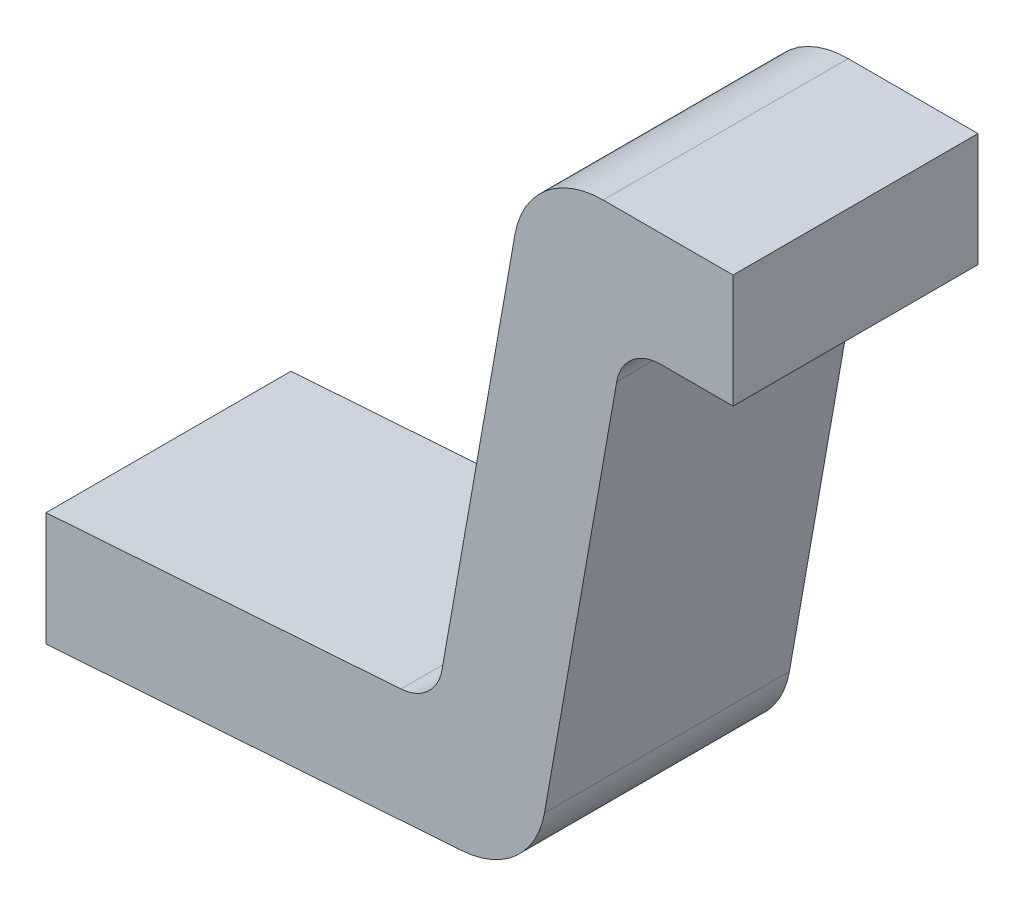
ISO-10303-21;
HEADER;
FILE_DESCRIPTION(('STEP AP214'),'2;1');
FILE_NAME('part.step','',(''),(''),'','','');
FILE_SCHEMA(('AUTOMOTIVE_DESIGN { 1 0 10303 214 1 1 1 1 }'));
ENDSEC;
DATA;
#1=APPLICATION_CONTEXT('core data for automotive mechanical design processes');
#2=APPLICATION_PROTOCOL_DEFINITION('international standard','automotive_design',2000,#1);
#3=PRODUCT_CONTEXT('',#1,'mechanical');
#4=PRODUCT('Part','Part','',(#3));
#5=PRODUCT_RELATED_PRODUCT_CATEGORY('part','',(#4));
#6=PRODUCT_DEFINITION_FORMATION('','',#4);
#7=PRODUCT_DEFINITION_CONTEXT('part definition',#1,'design');
#8=PRODUCT_DEFINITION('design','',#6,#7);
#9=PRODUCT_DEFINITION_SHAPE('','',#8);
#10=(LENGTH_UNIT() NAMED_UNIT(*) SI_UNIT(.MILLI.,.METRE.));
#11=(NAMED_UNIT(*) PLANE_ANGLE_UNIT() SI_UNIT($,.RADIAN.));
#12=(NAMED_UNIT(*) SI_UNIT($,.STERADIAN.) SOLID_ANGLE_UNIT());
#13=UNCERTAINTY_MEASURE_WITH_UNIT(LENGTH_MEASURE(1.E-05),#10,'distance_accuracy_value','');
#14=(GEOMETRIC_REPRESENTATION_CONTEXT(3) GLOBAL_UNCERTAINTY_ASSIGNED_CONTEXT((#13)) GLOBAL_UNIT_ASSIGNED_CONTEXT((#10,
#11,#12)) REPRESENTATION_CONTEXT('',''));
#15=CARTESIAN_POINT('',(0.,0.,0.));
#16=DIRECTION('',(0.,0.,1.));
#17=DIRECTION('',(1.,0.,0.));
#18=AXIS2_PLACEMENT_3D('',#15,#16,#17);
#19=CARTESIAN_POINT('',(1.029116687923,0.845,0.));
#20=DIRECTION('',(0.,0.,1.));
#21=DIRECTION('',(-0.642787609686799,0.76604444311876,0.));
#22=AXIS2_PLACEMENT_3D('',#19,#20,#21);
#23=CYLINDRICAL_SURFACE('',#22,0.075);
#24=DIRECTION('',(0.,0.,1.));
#25=VECTOR('',#24,1.);
#26=CARTESIAN_POINT('',(0.98090761719649,0.902453333233907,0.));
#27=LINE('',#26,#25);
#28=CARTESIAN_POINT('',(0.98090761719649,0.902453333233907,0.));
#29=VERTEX_POINT('',#28);
#30=CARTESIAN_POINT('',(0.98090761719649,0.902453333233907,0.41));
#31=VERTEX_POINT('',#30);
#32=EDGE_CURVE('E232',#29,#31,#27,.T.);
#33=ORIENTED_EDGE('',*,*,#32,.F.);
#34=CARTESIAN_POINT('',(1.029116687923,0.845,0.));
#35=DIRECTION('',(0.,0.,-1.));
#36=DIRECTION('',(-0.642787609686799,0.76604444311876,0.));
#37=AXIS2_PLACEMENT_3D('',#34,#35,#36);
#38=CIRCLE('',#37,0.075);
#39=CARTESIAN_POINT('',(1.029116687923,0.92,0.));
#40=VERTEX_POINT('',#39);
#41=EDGE_CURVE('E297',#29,#40,#38,.T.);
#42=ORIENTED_EDGE('',*,*,#41,.T.);
#43=DIRECTION('',(0.,0.,1.));
#44=VECTOR('',#43,1.);
#45=CARTESIAN_POINT('',(1.029116687923,0.92,0.));
#46=LINE('',#45,#44);
#47=CARTESIAN_POINT('',(1.029116687923,0.92,0.41));
#48=VERTEX_POINT('',#47);
#49=EDGE_CURVE('E11',#40,#48,#46,.T.);
#50=ORIENTED_EDGE('',*,*,#49,.T.);
#51=CARTESIAN_POINT('',(1.029116687923,0.845,0.41));
#52=DIRECTION('',(0.,0.,1.));
#53=DIRECTION('',(-0.642787609686799,0.76604444311876,0.));
#54=AXIS2_PLACEMENT_3D('',#51,#52,#53);
#55=CIRCLE('',#54,0.075);
#56=EDGE_CURVE('E249',#48,#31,#55,.T.);
#57=ORIENTED_EDGE('',*,*,#56,.T.);
#58=EDGE_LOOP('',(#33,#42,#50,#57));
#59=FACE_BOUND('',#58,.T.);
#60=ADVANCED_FACE('F16',(#59),#23,.F.);
#61=CARTESIAN_POINT('',(0.966184215585,0.92,0.));
#62=DIRECTION('',(0.,-1.,0.));
#63=DIRECTION('',(0.,0.,-1.));
#64=AXIS2_PLACEMENT_3D('',#61,#62,#63);
#65=PLANE('',#64);
#66=ORIENTED_EDGE('',*,*,#49,.F.);
#67=DIRECTION('',(1.,0.,0.));
#68=VECTOR('',#67,1.);
#69=CARTESIAN_POINT('',(0.966184215585,0.92,0.));
#70=LINE('',#69,#68);
#71=CARTESIAN_POINT('',(1.15,0.92,0.));
#72=VERTEX_POINT('',#71);
#73=EDGE_CURVE('E197',#40,#72,#70,.T.);
#74=ORIENTED_EDGE('',*,*,#73,.T.);
#75=DIRECTION('',(0.,0.,1.));
#76=VECTOR('',#75,1.);
#77=CARTESIAN_POINT('',(1.15,0.92,0.));
#78=LINE('',#77,#76);
#79=CARTESIAN_POINT('',(1.15,0.92,0.41));
#80=VERTEX_POINT('',#79);
#81=EDGE_CURVE('E340',#72,#80,#78,.T.);
#82=ORIENTED_EDGE('',*,*,#81,.T.);
#83=DIRECTION('',(1.,0.,0.));
#84=VECTOR('',#83,1.);
#85=CARTESIAN_POINT('',(0.966184215585,0.92,0.41));
#86=LINE('',#85,#84);
#87=EDGE_CURVE('E244',#48,#80,#86,.T.);
#88=ORIENTED_EDGE('',*,*,#87,.F.);
#89=EDGE_LOOP('',(#66,#74,#82,#88));
#90=FACE_BOUND('',#89,.T.);
#91=ADVANCED_FACE('F375',(#90),#65,.T.);
#92=CARTESIAN_POINT('',(0.588978184151,0.306832469713,0.));
#93=DIRECTION('',(0.,0.,1.));
#94=DIRECTION('',(0.669130606359133,-0.743144825477147,0.));
#95=AXIS2_PLACEMENT_3D('',#92,#93,#94);
#96=CYLINDRICAL_SURFACE('',#95,0.075);
#97=DIRECTION('',(0.,0.,1.));
#98=VECTOR('',#97,1.);
#99=CARTESIAN_POINT('',(0.639162979627935,0.251096607802214,0.));
#100=LINE('',#99,#98);
#101=CARTESIAN_POINT('',(0.639162979627935,0.251096607802214,0.));
#102=VERTEX_POINT('',#101);
#103=CARTESIAN_POINT('',(0.639162979627935,0.251096607802214,0.41));
#104=VERTEX_POINT('',#103);
#105=EDGE_CURVE('E192',#102,#104,#100,.T.);
#106=ORIENTED_EDGE('',*,*,#105,.F.);
#107=CARTESIAN_POINT('',(0.588978184151,0.306832469713,0.));
#108=DIRECTION('',(0.,0.,-1.));
#109=DIRECTION('',(0.669130606359133,-0.743144825477147,0.));
#110=AXIS2_PLACEMENT_3D('',#107,#108,#109);
#111=CIRCLE('',#110,0.075);
#112=CARTESIAN_POINT('',(0.594209919682,0.232015165944,0.));
#113=VERTEX_POINT('',#112);
#114=EDGE_CURVE('E189',#102,#113,#111,.T.);
#115=ORIENTED_EDGE('',*,*,#114,.T.);
#116=DIRECTION('',(0.,0.,1.));
#117=VECTOR('',#116,1.);
#118=CARTESIAN_POINT('',(0.594209919682,0.232015165944,0.));
#119=LINE('',#118,#117);
#120=CARTESIAN_POINT('',(0.594209919682,0.232015165944,0.41));
#121=VERTEX_POINT('',#120);
#122=EDGE_CURVE('E27',#113,#121,#119,.T.);
#123=ORIENTED_EDGE('',*,*,#122,.T.);
#124=CARTESIAN_POINT('',(0.588978184151,0.306832469713,0.41));
#125=DIRECTION('',(0.,0.,1.));
#126=DIRECTION('',(0.669130606359133,-0.743144825477147,0.));
#127=AXIS2_PLACEMENT_3D('',#124,#125,#126);
#128=CIRCLE('',#127,0.075);
#129=EDGE_CURVE('E241',#121,#104,#128,.T.);
#130=ORIENTED_EDGE('',*,*,#129,.T.);
#131=EDGE_LOOP('',(#106,#115,#123,#130));
#132=FACE_BOUND('',#131,.T.);
#133=ADVANCED_FACE('F190',(#132),#96,.F.);
#134=CARTESIAN_POINT('',(0.652663603731,0.236102645716,0.));
#135=DIRECTION('',(-0.0697564737441177,0.997564050259825,0.));
#136=DIRECTION('',(0.,0.,1.));
#137=AXIS2_PLACEMENT_3D('',#134,#135,#136);
#138=PLANE('',#137);
#139=ORIENTED_EDGE('',*,*,#122,.F.);
#140=DIRECTION('',(-0.997564050259825,-0.0697564737441177,0.));
#141=VECTOR('',#140,1.);
#142=CARTESIAN_POINT('',(0.652663603731,0.236102645716,0.));
#143=LINE('',#142,#141);
#144=CARTESIAN_POINT('',(0.,0.190463960635,0.));
#145=VERTEX_POINT('',#144);
#146=EDGE_CURVE('E180',#113,#145,#143,.T.);
#147=ORIENTED_EDGE('',*,*,#146,.T.);
#148=DIRECTION('',(0.,0.,1.));
#149=VECTOR('',#148,1.);
#150=CARTESIAN_POINT('',(0.,0.190463960635,0.));
#151=LINE('',#150,#149);
#152=CARTESIAN_POINT('',(0.,0.190463960635,0.41));
#153=VERTEX_POINT('',#152);
#154=EDGE_CURVE('E240',#145,#153,#151,.T.);
#155=ORIENTED_EDGE('',*,*,#154,.T.);
#156=DIRECTION('',(-0.997564050259825,-0.0697564737441177,0.));
#157=VECTOR('',#156,1.);
#158=CARTESIAN_POINT('',(0.652663603731,0.236102645716,0.41));
#159=LINE('',#158,#157);
#160=EDGE_CURVE('E183',#121,#153,#159,.T.);
#161=ORIENTED_EDGE('',*,*,#160,.F.);
#162=EDGE_LOOP('',(#139,#147,#155,#161));
#163=FACE_BOUND('',#162,.T.);
#164=ADVANCED_FACE('F178',(#163),#138,.T.);
#165=CARTESIAN_POINT('',(0.68662916084,0.198380072917,0.));
#166=DIRECTION('',(0.,0.,1.));
#167=DIRECTION('',(0.669130606359133,-0.743144825477147,0.));
#168=AXIS2_PLACEMENT_3D('',#165,#166,#167);
#169=CYLINDRICAL_SURFACE('',#168,0.15);
#170=DIRECTION('',(0.,0.,1.));
#171=VECTOR('',#170,1.);
#172=CARTESIAN_POINT('',(0.78699875179387,0.086908349095428,0.));
#173=LINE('',#172,#171);
#174=CARTESIAN_POINT('',(0.78699875179387,0.086908349095428,0.));
#175=VERTEX_POINT('',#174);
#176=CARTESIAN_POINT('',(0.78699875179387,0.086908349095428,0.41));
#177=VERTEX_POINT('',#176);
#178=EDGE_CURVE('E217',#175,#177,#173,.T.);
#179=ORIENTED_EDGE('',*,*,#178,.F.);
#180=CARTESIAN_POINT('',(0.68662916084,0.198380072917,0.));
#181=DIRECTION('',(0.,0.,1.));
#182=DIRECTION('',(0.669130606359133,-0.743144825477147,0.));
#183=AXIS2_PLACEMENT_3D('',#180,#181,#182);
#184=CIRCLE('',#183,0.15);
#185=CARTESIAN_POINT('',(0.834350323792,0.172332846267,0.));
#186=VERTEX_POINT('',#185);
#187=EDGE_CURVE('E329',#175,#186,#184,.T.);
#188=ORIENTED_EDGE('',*,*,#187,.T.);
#189=DIRECTION('',(0.,0.,1.));
#190=VECTOR('',#189,1.);
#191=CARTESIAN_POINT('',(0.834350323792,0.172332846267,0.));
#192=LINE('',#191,#190);
#193=CARTESIAN_POINT('',(0.834350323792,0.172332846267,0.41));
#194=VERTEX_POINT('',#193);
#195=EDGE_CURVE('E42',#186,#194,#192,.T.);
#196=ORIENTED_EDGE('',*,*,#195,.T.);
#197=CARTESIAN_POINT('',(0.68662916084,0.198380072917,0.41));
#198=DIRECTION('',(0.,0.,-1.));
#199=DIRECTION('',(0.669130606359133,-0.743144825477147,0.));
#200=AXIS2_PLACEMENT_3D('',#197,#198,#199);
#201=CIRCLE('',#200,0.15);
#202=EDGE_CURVE('E278',#194,#177,#201,.T.);
#203=ORIENTED_EDGE('',*,*,#202,.T.);
#204=EDGE_LOOP('',(#179,#188,#196,#203));
#205=FACE_BOUND('',#204,.T.);
#206=ADVANCED_FACE('F390',(#205),#169,.T.);
#207=CARTESIAN_POINT('',(0.814,0.05692042492202,0.));
#208=DIRECTION('',(0.98480775301219,-0.173648177667033,0.));
#209=DIRECTION('',(0.,0.,-1.));
#210=AXIS2_PLACEMENT_3D('',#207,#208,#209);
#211=PLANE('',#210);
#212=DIRECTION('',(0.,0.,-1.));
#213=VECTOR('',#212,1.);
#214=CARTESIAN_POINT('',(0.955256106447,0.858023613325,0.));
#215=LINE('',#214,#213);
#216=CARTESIAN_POINT('',(0.955256106447,0.858023613325,0.41));
#217=VERTEX_POINT('',#216);
#218=CARTESIAN_POINT('',(0.955256106447,0.858023613325,0.));
#219=VERTEX_POINT('',#218);
#220=EDGE_CURVE('E280',#217,#219,#215,.T.);
#221=ORIENTED_EDGE('',*,*,#220,.F.);
#222=DIRECTION('',(0.173648177667033,0.98480775301219,0.));
#223=VECTOR('',#222,1.);
#224=CARTESIAN_POINT('',(0.814,0.05692042492202,0.41));
#225=LINE('',#224,#223);
#226=EDGE_CURVE('E314',#194,#217,#225,.T.);
#227=ORIENTED_EDGE('',*,*,#226,.F.);
#228=ORIENTED_EDGE('',*,*,#195,.F.);
#229=DIRECTION('',(0.173648177667033,0.98480775301219,0.));
#230=VECTOR('',#229,1.);
#231=CARTESIAN_POINT('',(0.814,0.05692042492202,0.));
#232=LINE('',#231,#230);
#233=EDGE_CURVE('E301',#186,#219,#232,.T.);
#234=ORIENTED_EDGE('',*,*,#233,.T.);
#235=EDGE_LOOP('',(#221,#227,#228,#234));
#236=FACE_BOUND('',#235,.T.);
#237=ADVANCED_FACE('F385',(#236),#211,.T.);
#238=CARTESIAN_POINT('',(0.657250080214,0.470646116994,0.));
#239=DIRECTION('',(0.,0.,1.));
#240=DIRECTION('',(1.,0.,0.));
#241=AXIS2_PLACEMENT_3D('',#238,#239,#240);
#242=PLANE('',#241);
#243=CARTESIAN_POINT('',(0.68662916084,0.198380072917,0.));
#244=DIRECTION('',(0.,0.,1.));
#245=DIRECTION('',(0.669130606359133,-0.743144825477147,0.));
#246=AXIS2_PLACEMENT_3D('',#243,#244,#245);
#247=CIRCLE('',#246,0.15);
#248=CARTESIAN_POINT('',(0.697092631902,0.04874546537821,0.));
#249=VERTEX_POINT('',#248);
#250=EDGE_CURVE('E215',#249,#175,#247,.T.);
#251=ORIENTED_EDGE('',*,*,#250,.F.);
#252=DIRECTION('',(0.997564050259825,0.0697564737441177,0.));
#253=VECTOR('',#252,1.);
#254=CARTESIAN_POINT('',(0.,0.,0.));
#255=LINE('',#254,#253);
#256=CARTESIAN_POINT('',(0.,0.,0.));
#257=VERTEX_POINT('',#256);
#258=EDGE_CURVE('E130',#257,#249,#255,.T.);
#259=ORIENTED_EDGE('',*,*,#258,.F.);
#260=DIRECTION('',(0.,-1.,0.));
#261=VECTOR('',#260,1.);
#262=CARTESIAN_POINT('',(0.,0.190463960635,0.));
#263=LINE('',#262,#261);
#264=EDGE_CURVE('E203',#145,#257,#263,.T.);
#265=ORIENTED_EDGE('',*,*,#264,.F.);
#266=ORIENTED_EDGE('',*,*,#146,.F.);
#267=ORIENTED_EDGE('',*,*,#114,.F.);
#268=CARTESIAN_POINT('',(0.588978184151,0.306832469713,0.));
#269=DIRECTION('',(0.,0.,-1.));
#270=DIRECTION('',(0.669130606359133,-0.743144825477147,0.));
#271=AXIS2_PLACEMENT_3D('',#268,#269,#270);
#272=CIRCLE('',#271,0.075);
#273=CARTESIAN_POINT('',(0.662838765627,0.293808856388,0.));
#274=VERTEX_POINT('',#273);
#275=EDGE_CURVE('E253',#274,#102,#272,.T.);
#276=ORIENTED_EDGE('',*,*,#275,.F.);
#277=DIRECTION('',(-0.173648177667033,-0.98480775301219,0.));
#278=VECTOR('',#277,1.);
#279=CARTESIAN_POINT('',(0.806755285661,1.11,0.));
#280=LINE('',#279,#278);
#281=CARTESIAN_POINT('',(0.784899067386,0.98604722665,0.));
#282=VERTEX_POINT('',#281);
#283=EDGE_CURVE('E233',#282,#274,#280,.T.);
#284=ORIENTED_EDGE('',*,*,#283,.F.);
#285=CARTESIAN_POINT('',(0.932620230338,0.96,0.));
#286=DIRECTION('',(0.,0.,1.));
#287=DIRECTION('',(-0.642787609686799,0.76604444311876,0.));
#288=AXIS2_PLACEMENT_3D('',#285,#286,#287);
#289=CIRCLE('',#288,0.15);
#290=CARTESIAN_POINT('',(0.83620208888498,1.07490666646781,0.));
#291=VERTEX_POINT('',#290);
#292=EDGE_CURVE('E205',#291,#282,#289,.T.);
#293=ORIENTED_EDGE('',*,*,#292,.F.);
#294=CARTESIAN_POINT('',(0.932620230338,0.96,0.));
#295=DIRECTION('',(0.,0.,1.));
#296=DIRECTION('',(-0.642787609686799,0.76604444311876,0.));
#297=AXIS2_PLACEMENT_3D('',#294,#295,#296);
#298=CIRCLE('',#297,0.15);
#299=CARTESIAN_POINT('',(0.932620230338,1.11,0.));
#300=VERTEX_POINT('',#299);
#301=EDGE_CURVE('E222',#300,#291,#298,.T.);
#302=ORIENTED_EDGE('',*,*,#301,.F.);
#303=DIRECTION('',(-1.,0.,0.));
#304=VECTOR('',#303,1.);
#305=CARTESIAN_POINT('',(1.15,1.11,0.));
#306=LINE('',#305,#304);
#307=CARTESIAN_POINT('',(1.15,1.11,0.));
#308=VERTEX_POINT('',#307);
#309=EDGE_CURVE('E211',#308,#300,#306,.T.);
#310=ORIENTED_EDGE('',*,*,#309,.F.);
#311=DIRECTION('',(0.,1.,0.));
#312=VECTOR('',#311,1.);
#313=CARTESIAN_POINT('',(1.15,0.92,0.));
#314=LINE('',#313,#312);
#315=EDGE_CURVE('E292',#72,#308,#314,.T.);
#316=ORIENTED_EDGE('',*,*,#315,.F.);
#317=ORIENTED_EDGE('',*,*,#73,.F.);
#318=ORIENTED_EDGE('',*,*,#41,.F.);
#319=CARTESIAN_POINT('',(1.029116687923,0.845,0.));
#320=DIRECTION('',(0.,0.,-1.));
#321=DIRECTION('',(-0.642787609686799,0.76604444311876,0.));
#322=AXIS2_PLACEMENT_3D('',#319,#320,#321);
#323=CIRCLE('',#322,0.075);
#324=EDGE_CURVE('E228',#219,#29,#323,.T.);
#325=ORIENTED_EDGE('',*,*,#324,.F.);
#326=ORIENTED_EDGE('',*,*,#233,.F.);
#327=ORIENTED_EDGE('',*,*,#187,.F.);
#328=EDGE_LOOP('',(#251,#259,#265,#266,#267,#276,#284,#293,#302,#310,#316,#317,#318,#325,#326,#327));
#329=FACE_BOUND('',#328,.T.);
#330=ADVANCED_FACE('F201',(#329),#242,.F.);
#331=CARTESIAN_POINT('',(0.932620230338,0.96,0.));
#332=DIRECTION('',(0.,0.,1.));
#333=DIRECTION('',(-0.642787609686799,0.76604444311876,0.));
#334=AXIS2_PLACEMENT_3D('',#331,#332,#333);
#335=CYLINDRICAL_SURFACE('',#334,0.15);
#336=DIRECTION('',(0.,0.,1.));
#337=VECTOR('',#336,1.);
#338=CARTESIAN_POINT('',(0.83620208888498,1.07490666646781,0.));
#339=LINE('',#338,#337);
#340=CARTESIAN_POINT('',(0.83620208888498,1.07490666646781,0.41));
#341=VERTEX_POINT('',#340);
#342=EDGE_CURVE('E226',#291,#341,#339,.T.);
#343=ORIENTED_EDGE('',*,*,#342,.F.);
#344=ORIENTED_EDGE('',*,*,#292,.T.);
#345=DIRECTION('',(0.,0.,1.));
#346=VECTOR('',#345,1.);
#347=CARTESIAN_POINT('',(0.784899067386,0.98604722665,0.));
#348=LINE('',#347,#346);
#349=CARTESIAN_POINT('',(0.784899067386,0.98604722665,0.41));
#350=VERTEX_POINT('',#349);
#351=EDGE_CURVE('E236',#282,#350,#348,.T.);
#352=ORIENTED_EDGE('',*,*,#351,.T.);
#353=CARTESIAN_POINT('',(0.932620230338,0.96,0.41));
#354=DIRECTION('',(0.,0.,-1.));
#355=DIRECTION('',(-0.642787609686799,0.76604444311876,0.));
#356=AXIS2_PLACEMENT_3D('',#353,#354,#355);
#357=CIRCLE('',#356,0.15);
#358=EDGE_CURVE('E20',#350,#341,#357,.T.);
#359=ORIENTED_EDGE('',*,*,#358,.T.);
#360=EDGE_LOOP('',(#343,#344,#352,#359));
#361=FACE_BOUND('',#360,.T.);
#362=ADVANCED_FACE('F352',(#361),#335,.T.);
#363=CARTESIAN_POINT('',(1.15,1.11,0.));
#364=DIRECTION('',(0.,1.,0.));
#365=DIRECTION('',(1.,0.,0.));
#366=AXIS2_PLACEMENT_3D('',#363,#364,#365);
#367=PLANE('',#366);
#368=DIRECTION('',(0.,0.,-1.));
#369=VECTOR('',#368,1.);
#370=CARTESIAN_POINT('',(0.932620230338,1.11,0.));
#371=LINE('',#370,#369);
#372=CARTESIAN_POINT('',(0.932620230338,1.11,0.41));
#373=VERTEX_POINT('',#372);
#374=EDGE_CURVE('E274',#373,#300,#371,.T.);
#375=ORIENTED_EDGE('',*,*,#374,.F.);
#376=DIRECTION('',(-1.,0.,0.));
#377=VECTOR('',#376,1.);
#378=CARTESIAN_POINT('',(1.15,1.11,0.41));
#379=LINE('',#378,#377);
#380=CARTESIAN_POINT('',(1.15,1.11,0.41));
#381=VERTEX_POINT('',#380);
#382=EDGE_CURVE('E269',#381,#373,#379,.T.);
#383=ORIENTED_EDGE('',*,*,#382,.F.);
#384=DIRECTION('',(0.,0.,1.));
#385=VECTOR('',#384,1.);
#386=CARTESIAN_POINT('',(1.15,1.11,0.));
#387=LINE('',#386,#385);
#388=EDGE_CURVE('E296',#308,#381,#387,.T.);
#389=ORIENTED_EDGE('',*,*,#388,.F.);
#390=ORIENTED_EDGE('',*,*,#309,.T.);
#391=EDGE_LOOP('',(#375,#383,#389,#390));
#392=FACE_BOUND('',#391,.T.);
#393=ADVANCED_FACE('F364',(#392),#367,.T.);
#394=CARTESIAN_POINT('',(1.15,0.92,0.));
#395=DIRECTION('',(1.,0.,0.));
#396=DIRECTION('',(0.,1.,0.));
#397=AXIS2_PLACEMENT_3D('',#394,#395,#396);
#398=PLANE('',#397);
#399=ORIENTED_EDGE('',*,*,#315,.T.);
#400=ORIENTED_EDGE('',*,*,#388,.T.);
#401=DIRECTION('',(0.,1.,0.));
#402=VECTOR('',#401,1.);
#403=CARTESIAN_POINT('',(1.15,0.92,0.41));
#404=LINE('',#403,#402);
#405=EDGE_CURVE('E248',#80,#381,#404,.T.);
#406=ORIENTED_EDGE('',*,*,#405,.F.);
#407=ORIENTED_EDGE('',*,*,#81,.F.);
#408=EDGE_LOOP('',(#399,#400,#406,#407));
#409=FACE_BOUND('',#408,.T.);
#410=ADVANCED_FACE('F370',(#409),#398,.T.);
#411=CARTESIAN_POINT('',(0.,0.,0.));
#412=DIRECTION('',(0.0697564737441177,-0.997564050259825,0.));
#413=DIRECTION('',(0.,0.,-1.));
#414=AXIS2_PLACEMENT_3D('',#411,#412,#413);
#415=PLANE('',#414);
#416=DIRECTION('',(0.,0.,-1.));
#417=VECTOR('',#416,1.);
#418=CARTESIAN_POINT('',(0.697092631902,0.04874546537821,0.));
#419=LINE('',#418,#417);
#420=CARTESIAN_POINT('',(0.697092631902,0.04874546537821,0.41));
#421=VERTEX_POINT('',#420);
#422=EDGE_CURVE('E227',#421,#249,#419,.T.);
#423=ORIENTED_EDGE('',*,*,#422,.F.);
#424=DIRECTION('',(0.997564050259825,0.0697564737441177,0.));
#425=VECTOR('',#424,1.);
#426=CARTESIAN_POINT('',(0.,0.,0.41));
#427=LINE('',#426,#425);
#428=CARTESIAN_POINT('',(0.,0.,0.41));
#429=VERTEX_POINT('',#428);
#430=EDGE_CURVE('E258',#429,#421,#427,.T.);
#431=ORIENTED_EDGE('',*,*,#430,.F.);
#432=DIRECTION('',(0.,0.,1.));
#433=VECTOR('',#432,1.);
#434=CARTESIAN_POINT('',(0.,0.,0.));
#435=LINE('',#434,#433);
#436=EDGE_CURVE('E237',#257,#429,#435,.T.);
#437=ORIENTED_EDGE('',*,*,#436,.F.);
#438=ORIENTED_EDGE('',*,*,#258,.T.);
#439=EDGE_LOOP('',(#423,#431,#437,#438));
#440=FACE_BOUND('',#439,.T.);
#441=ADVANCED_FACE('F596',(#440),#415,.T.);
#442=CARTESIAN_POINT('',(0.,0.190463960635,0.));
#443=DIRECTION('',(-1.,0.,0.));
#444=DIRECTION('',(0.,1.,0.));
#445=AXIS2_PLACEMENT_3D('',#442,#443,#444);
#446=PLANE('',#445);
#447=ORIENTED_EDGE('',*,*,#264,.T.);
#448=ORIENTED_EDGE('',*,*,#436,.T.);
#449=DIRECTION('',(0.,-1.,0.));
#450=VECTOR('',#449,1.);
#451=CARTESIAN_POINT('',(0.,0.190463960635,0.41));
#452=LINE('',#451,#450);
#453=EDGE_CURVE('E254',#153,#429,#452,.T.);
#454=ORIENTED_EDGE('',*,*,#453,.F.);
#455=ORIENTED_EDGE('',*,*,#154,.F.);
#456=EDGE_LOOP('',(#447,#448,#454,#455));
#457=FACE_BOUND('',#456,.T.);
#458=ADVANCED_FACE('F592',(#457),#446,.T.);
#459=CARTESIAN_POINT('',(0.806755285661,1.11,0.));
#460=DIRECTION('',(-0.98480775301219,0.173648177667033,0.));
#461=DIRECTION('',(0.,0.,1.));
#462=AXIS2_PLACEMENT_3D('',#459,#460,#461);
#463=PLANE('',#462);
#464=DIRECTION('',(0.,0.,-1.));
#465=VECTOR('',#464,1.);
#466=CARTESIAN_POINT('',(0.662838765627,0.293808856388,0.));
#467=LINE('',#466,#465);
#468=CARTESIAN_POINT('',(0.662838765627,0.293808856388,0.41));
#469=VERTEX_POINT('',#468);
#470=EDGE_CURVE('E259',#469,#274,#467,.T.);
#471=ORIENTED_EDGE('',*,*,#470,.F.);
#472=DIRECTION('',(-0.173648177667033,-0.98480775301219,0.));
#473=VECTOR('',#472,1.);
#474=CARTESIAN_POINT('',(0.806755285661,1.11,0.41));
#475=LINE('',#474,#473);
#476=EDGE_CURVE('E144',#350,#469,#475,.T.);
#477=ORIENTED_EDGE('',*,*,#476,.F.);
#478=ORIENTED_EDGE('',*,*,#351,.F.);
#479=ORIENTED_EDGE('',*,*,#283,.T.);
#480=EDGE_LOOP('',(#471,#477,#478,#479));
#481=FACE_BOUND('',#480,.T.);
#482=ADVANCED_FACE('F18',(#481),#463,.T.);
#483=CARTESIAN_POINT('',(0.657250080214,0.470646116994,0.41));
#484=DIRECTION('',(0.,0.,1.));
#485=DIRECTION('',(1.,0.,0.));
#486=AXIS2_PLACEMENT_3D('',#483,#484,#485);
#487=PLANE('',#486);
#488=ORIENTED_EDGE('',*,*,#202,.F.);
#489=ORIENTED_EDGE('',*,*,#226,.T.);
#490=CARTESIAN_POINT('',(1.029116687923,0.845,0.41));
#491=DIRECTION('',(0.,0.,1.));
#492=DIRECTION('',(-0.642787609686799,0.76604444311876,0.));
#493=AXIS2_PLACEMENT_3D('',#490,#491,#492);
#494=CIRCLE('',#493,0.075);
#495=EDGE_CURVE('E284',#31,#217,#494,.T.);
#496=ORIENTED_EDGE('',*,*,#495,.F.);
#497=ORIENTED_EDGE('',*,*,#56,.F.);
#498=ORIENTED_EDGE('',*,*,#87,.T.);
#499=ORIENTED_EDGE('',*,*,#405,.T.);
#500=ORIENTED_EDGE('',*,*,#382,.T.);
#501=CARTESIAN_POINT('',(0.932620230338,0.96,0.41));
#502=DIRECTION('',(0.,0.,-1.));
#503=DIRECTION('',(-0.642787609686799,0.76604444311876,0.));
#504=AXIS2_PLACEMENT_3D('',#501,#502,#503);
#505=CIRCLE('',#504,0.15);
#506=EDGE_CURVE('E279',#341,#373,#505,.T.);
#507=ORIENTED_EDGE('',*,*,#506,.F.);
#508=ORIENTED_EDGE('',*,*,#358,.F.);
#509=ORIENTED_EDGE('',*,*,#476,.T.);
#510=CARTESIAN_POINT('',(0.588978184151,0.306832469713,0.41));
#511=DIRECTION('',(0.,0.,1.));
#512=DIRECTION('',(0.669130606359133,-0.743144825477147,0.));
#513=AXIS2_PLACEMENT_3D('',#510,#511,#512);
#514=CIRCLE('',#513,0.075);
#515=EDGE_CURVE('E252',#104,#469,#514,.T.);
#516=ORIENTED_EDGE('',*,*,#515,.F.);
#517=ORIENTED_EDGE('',*,*,#129,.F.);
#518=ORIENTED_EDGE('',*,*,#160,.T.);
#519=ORIENTED_EDGE('',*,*,#453,.T.);
#520=ORIENTED_EDGE('',*,*,#430,.T.);
#521=CARTESIAN_POINT('',(0.68662916084,0.198380072917,0.41));
#522=DIRECTION('',(0.,0.,-1.));
#523=DIRECTION('',(0.669130606359133,-0.743144825477147,0.));
#524=AXIS2_PLACEMENT_3D('',#521,#522,#523);
#525=CIRCLE('',#524,0.15);
#526=EDGE_CURVE('E221',#177,#421,#525,.T.);
#527=ORIENTED_EDGE('',*,*,#526,.F.);
#528=EDGE_LOOP('',(#488,#489,#496,#497,#498,#499,#500,#507,#508,#509,#516,#517,#518,#519,#520,#527));
#529=FACE_BOUND('',#528,.T.);
#530=ADVANCED_FACE('F387',(#529),#487,.T.);
#531=CARTESIAN_POINT('',(0.932620230338,0.96,0.));
#532=DIRECTION('',(0.,0.,1.));
#533=DIRECTION('',(-0.642787609686799,0.76604444311876,0.));
#534=AXIS2_PLACEMENT_3D('',#531,#532,#533);
#535=CYLINDRICAL_SURFACE('',#534,0.15);
#536=ORIENTED_EDGE('',*,*,#301,.T.);
#537=ORIENTED_EDGE('',*,*,#342,.T.);
#538=ORIENTED_EDGE('',*,*,#506,.T.);
#539=ORIENTED_EDGE('',*,*,#374,.T.);
#540=EDGE_LOOP('',(#536,#537,#538,#539));
#541=FACE_BOUND('',#540,.T.);
#542=ADVANCED_FACE('F355',(#541),#535,.T.);
#543=CARTESIAN_POINT('',(0.68662916084,0.198380072917,0.));
#544=DIRECTION('',(0.,0.,1.));
#545=DIRECTION('',(0.669130606359133,-0.743144825477147,0.));
#546=AXIS2_PLACEMENT_3D('',#543,#544,#545);
#547=CYLINDRICAL_SURFACE('',#546,0.15);
#548=ORIENTED_EDGE('',*,*,#250,.T.);
#549=ORIENTED_EDGE('',*,*,#178,.T.);
#550=ORIENTED_EDGE('',*,*,#526,.T.);
#551=ORIENTED_EDGE('',*,*,#422,.T.);
#552=EDGE_LOOP('',(#548,#549,#550,#551));
#553=FACE_BOUND('',#552,.T.);
#554=ADVANCED_FACE('F393',(#553),#547,.T.);
#555=CARTESIAN_POINT('',(0.588978184151,0.306832469713,0.));
#556=DIRECTION('',(0.,0.,1.));
#557=DIRECTION('',(0.669130606359133,-0.743144825477147,0.));
#558=AXIS2_PLACEMENT_3D('',#555,#556,#557);
#559=CYLINDRICAL_SURFACE('',#558,0.075);
#560=ORIENTED_EDGE('',*,*,#275,.T.);
#561=ORIENTED_EDGE('',*,*,#105,.T.);
#562=ORIENTED_EDGE('',*,*,#515,.T.);
#563=ORIENTED_EDGE('',*,*,#470,.T.);
#564=EDGE_LOOP('',(#560,#561,#562,#563));
#565=FACE_BOUND('',#564,.T.);
#566=ADVANCED_FACE('F345',(#565),#559,.F.);
#567=CARTESIAN_POINT('',(1.029116687923,0.845,0.));
#568=DIRECTION('',(0.,0.,1.));
#569=DIRECTION('',(-0.642787609686799,0.76604444311876,0.));
#570=AXIS2_PLACEMENT_3D('',#567,#568,#569);
#571=CYLINDRICAL_SURFACE('',#570,0.075);
#572=ORIENTED_EDGE('',*,*,#324,.T.);
#573=ORIENTED_EDGE('',*,*,#32,.T.);
#574=ORIENTED_EDGE('',*,*,#495,.T.);
#575=ORIENTED_EDGE('',*,*,#220,.T.);
#576=EDGE_LOOP('',(#572,#573,#574,#575));
#577=FACE_BOUND('',#576,.T.);
#578=ADVANCED_FACE('F381',(#577),#571,.F.);
#579=CLOSED_SHELL('',(#60,#91,#133,#164,#206,#237,#330,#362,#393,#410,#441,#458,#482,#530,#542,
#554,#566,#578));
#580=MANIFOLD_SOLID_BREP('B1',#579);
#581=ADVANCED_BREP_SHAPE_REPRESENTATION('',(#18,#580),#14);
#582=SHAPE_DEFINITION_REPRESENTATION(#9,#581);
ENDSEC;
END-ISO-10303-21;
